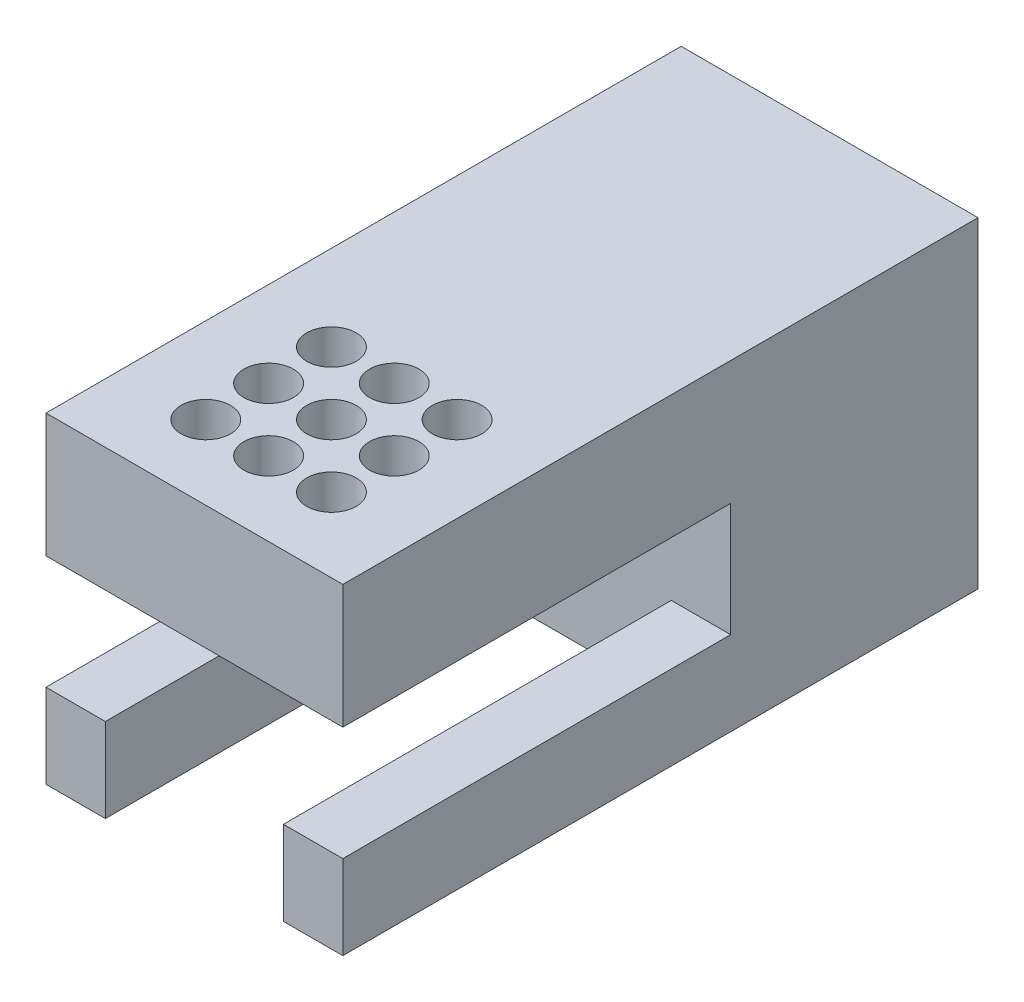
ISO-10303-21;
HEADER;
FILE_DESCRIPTION(('STEP AP214'),'2;1');
FILE_NAME('part.step','',(''),(''),'','','');
FILE_SCHEMA(('AUTOMOTIVE_DESIGN { 1 0 10303 214 1 1 1 1 }'));
ENDSEC;
DATA;
#1=APPLICATION_CONTEXT('core data for automotive mechanical design processes');
#2=APPLICATION_PROTOCOL_DEFINITION('international standard','automotive_design',2000,#1);
#3=PRODUCT_CONTEXT('',#1,'mechanical');
#4=PRODUCT('Part','Part','',(#3));
#5=PRODUCT_RELATED_PRODUCT_CATEGORY('part','',(#4));
#6=PRODUCT_DEFINITION_FORMATION('','',#4);
#7=PRODUCT_DEFINITION_CONTEXT('part definition',#1,'design');
#8=PRODUCT_DEFINITION('design','',#6,#7);
#9=PRODUCT_DEFINITION_SHAPE('','',#8);
#10=(LENGTH_UNIT() NAMED_UNIT(*) SI_UNIT(.MILLI.,.METRE.));
#11=(NAMED_UNIT(*) PLANE_ANGLE_UNIT() SI_UNIT($,.RADIAN.));
#12=(NAMED_UNIT(*) SI_UNIT($,.STERADIAN.) SOLID_ANGLE_UNIT());
#13=UNCERTAINTY_MEASURE_WITH_UNIT(LENGTH_MEASURE(1.E-05),#10,'distance_accuracy_value','');
#14=(GEOMETRIC_REPRESENTATION_CONTEXT(3) GLOBAL_UNCERTAINTY_ASSIGNED_CONTEXT((#13)) GLOBAL_UNIT_ASSIGNED_CONTEXT((#10,
#11,#12)) REPRESENTATION_CONTEXT('',''));
#15=CARTESIAN_POINT('',(0.,0.,0.));
#16=DIRECTION('',(0.,0.,1.));
#17=DIRECTION('',(1.,0.,0.));
#18=AXIS2_PLACEMENT_3D('',#15,#16,#17);
#19=CARTESIAN_POINT('',(0.,-8.,-10.14));
#20=DIRECTION('',(0.,0.,1.));
#21=DIRECTION('',(1.,0.,0.));
#22=AXIS2_PLACEMENT_3D('',#19,#20,#21);
#23=PLANE('',#22);
#24=DIRECTION('',(1.,0.,0.));
#25=VECTOR('',#24,1.);
#26=CARTESIAN_POINT('',(0.,-8.,-10.14));
#27=LINE('',#26,#25);
#28=CARTESIAN_POINT('',(-3.6,-8.,-10.14));
#29=VERTEX_POINT('',#28);
#30=CARTESIAN_POINT('',(3.6,-8.,-10.14));
#31=VERTEX_POINT('',#30);
#32=EDGE_CURVE('E204',#29,#31,#27,.T.);
#33=ORIENTED_EDGE('',*,*,#32,.T.);
#34=DIRECTION('',(0.,-1.,0.));
#35=VECTOR('',#34,1.);
#36=CARTESIAN_POINT('',(3.6,-8.,-10.14));
#37=LINE('',#36,#35);
#38=CARTESIAN_POINT('',(3.6,-4.6,-10.14));
#39=VERTEX_POINT('',#38);
#40=EDGE_CURVE('E63',#39,#31,#37,.T.);
#41=ORIENTED_EDGE('',*,*,#40,.F.);
#42=DIRECTION('',(-1.,0.,0.));
#43=VECTOR('',#42,1.);
#44=CARTESIAN_POINT('',(6.,-4.6,-10.14));
#45=LINE('',#44,#43);
#46=CARTESIAN_POINT('',(6.,-4.6,-10.14));
#47=VERTEX_POINT('',#46);
#48=EDGE_CURVE('E68',#47,#39,#45,.T.);
#49=ORIENTED_EDGE('',*,*,#48,.F.);
#50=DIRECTION('',(0.,1.,0.));
#51=VECTOR('',#50,1.);
#52=CARTESIAN_POINT('',(6.,-8.,-10.14));
#53=LINE('',#52,#51);
#54=CARTESIAN_POINT('',(6.,0.,-10.14));
#55=VERTEX_POINT('',#54);
#56=EDGE_CURVE('E219',#47,#55,#53,.T.);
#57=ORIENTED_EDGE('',*,*,#56,.T.);
#58=DIRECTION('',(1.,0.,0.));
#59=VECTOR('',#58,1.);
#60=CARTESIAN_POINT('',(0.,0.,-10.14));
#61=LINE('',#60,#59);
#62=CARTESIAN_POINT('',(-6.,0.,-10.14));
#63=VERTEX_POINT('',#62);
#64=EDGE_CURVE('E180',#63,#55,#61,.T.);
#65=ORIENTED_EDGE('',*,*,#64,.F.);
#66=DIRECTION('',(0.,1.,0.));
#67=VECTOR('',#66,1.);
#68=CARTESIAN_POINT('',(-6.,-8.,-10.14));
#69=LINE('',#68,#67);
#70=CARTESIAN_POINT('',(-6.,-4.6,-10.14));
#71=VERTEX_POINT('',#70);
#72=EDGE_CURVE('E223',#71,#63,#69,.T.);
#73=ORIENTED_EDGE('',*,*,#72,.F.);
#74=DIRECTION('',(-1.,0.,0.));
#75=VECTOR('',#74,1.);
#76=CARTESIAN_POINT('',(-6.,-4.6,-10.14));
#77=LINE('',#76,#75);
#78=CARTESIAN_POINT('',(-3.6,-4.6,-10.14));
#79=VERTEX_POINT('',#78);
#80=EDGE_CURVE('E185',#79,#71,#77,.T.);
#81=ORIENTED_EDGE('',*,*,#80,.F.);
#82=DIRECTION('',(0.,1.,0.));
#83=VECTOR('',#82,1.);
#84=CARTESIAN_POINT('',(-3.6,-8.,-10.14));
#85=LINE('',#84,#83);
#86=EDGE_CURVE('E181',#29,#79,#85,.T.);
#87=ORIENTED_EDGE('',*,*,#86,.F.);
#88=EDGE_LOOP('',(#33,#41,#49,#57,#65,#73,#81,#87));
#89=FACE_BOUND('',#88,.T.);
#90=ADVANCED_FACE('F47',(#89),#23,.T.);
#91=CARTESIAN_POINT('',(6.,5.,0.));
#92=DIRECTION('',(1.,0.,0.));
#93=DIRECTION('',(0.,0.,-1.));
#94=AXIS2_PLACEMENT_3D('',#91,#92,#93);
#95=PLANE('',#94);
#96=DIRECTION('',(0.,0.,1.));
#97=VECTOR('',#96,1.);
#98=CARTESIAN_POINT('',(6.,0.,0.));
#99=LINE('',#98,#97);
#100=CARTESIAN_POINT('',(6.,0.,5.54000000000001));
#101=VERTEX_POINT('',#100);
#102=EDGE_CURVE('E316',#55,#101,#99,.T.);
#103=ORIENTED_EDGE('',*,*,#102,.F.);
#104=ORIENTED_EDGE('',*,*,#56,.F.);
#105=DIRECTION('',(0.,0.,-1.));
#106=VECTOR('',#105,1.);
#107=CARTESIAN_POINT('',(6.,-4.6,9.70173040933697));
#108=LINE('',#107,#106);
#109=CARTESIAN_POINT('',(6.,-4.6,5.54000000000001));
#110=VERTEX_POINT('',#109);
#111=EDGE_CURVE('E153',#110,#47,#108,.T.);
#112=ORIENTED_EDGE('',*,*,#111,.F.);
#113=DIRECTION('',(0.,-1.,0.));
#114=VECTOR('',#113,1.);
#115=CARTESIAN_POINT('',(6.,-8.,5.54000000000001));
#116=LINE('',#115,#114);
#117=CARTESIAN_POINT('',(6.,-8.,5.54000000000001));
#118=VERTEX_POINT('',#117);
#119=EDGE_CURVE('E142',#110,#118,#116,.T.);
#120=ORIENTED_EDGE('',*,*,#119,.T.);
#121=DIRECTION('',(0.,0.,-1.));
#122=VECTOR('',#121,1.);
#123=CARTESIAN_POINT('',(6.,-8.,0.));
#124=LINE('',#123,#122);
#125=CARTESIAN_POINT('',(6.,-8.,-20.14));
#126=VERTEX_POINT('',#125);
#127=EDGE_CURVE('E207',#118,#126,#124,.T.);
#128=ORIENTED_EDGE('',*,*,#127,.T.);
#129=DIRECTION('',(0.,-1.,0.));
#130=VECTOR('',#129,1.);
#131=CARTESIAN_POINT('',(6.,5.,-20.14));
#132=LINE('',#131,#130);
#133=CARTESIAN_POINT('',(6.,5.,-20.14));
#134=VERTEX_POINT('',#133);
#135=EDGE_CURVE('E11',#134,#126,#132,.T.);
#136=ORIENTED_EDGE('',*,*,#135,.F.);
#137=DIRECTION('',(0.,0.,1.));
#138=VECTOR('',#137,1.);
#139=CARTESIAN_POINT('',(6.,5.,0.));
#140=LINE('',#139,#138);
#141=CARTESIAN_POINT('',(6.,5.,5.54000000000001));
#142=VERTEX_POINT('',#141);
#143=EDGE_CURVE('E266',#134,#142,#140,.T.);
#144=ORIENTED_EDGE('',*,*,#143,.T.);
#145=DIRECTION('',(0.,-1.,0.));
#146=VECTOR('',#145,1.);
#147=CARTESIAN_POINT('',(6.,5.,5.54000000000001));
#148=LINE('',#147,#146);
#149=EDGE_CURVE('E280',#142,#101,#148,.T.);
#150=ORIENTED_EDGE('',*,*,#149,.T.);
#151=EDGE_LOOP('',(#103,#104,#112,#120,#128,#136,#144,#150));
#152=FACE_BOUND('',#151,.T.);
#153=ADVANCED_FACE('F347',(#152),#95,.T.);
#154=CARTESIAN_POINT('',(0.,5.,-20.14));
#155=DIRECTION('',(0.,0.,-1.));
#156=DIRECTION('',(-1.,0.,0.));
#157=AXIS2_PLACEMENT_3D('',#154,#155,#156);
#158=PLANE('',#157);
#159=ORIENTED_EDGE('',*,*,#135,.T.);
#160=DIRECTION('',(1.,0.,0.));
#161=VECTOR('',#160,1.);
#162=CARTESIAN_POINT('',(0.,-8.,-20.14));
#163=LINE('',#162,#161);
#164=CARTESIAN_POINT('',(-6.,-8.,-20.14));
#165=VERTEX_POINT('',#164);
#166=EDGE_CURVE('E211',#165,#126,#163,.T.);
#167=ORIENTED_EDGE('',*,*,#166,.F.);
#168=DIRECTION('',(0.,-1.,0.));
#169=VECTOR('',#168,1.);
#170=CARTESIAN_POINT('',(-6.,5.,-20.14));
#171=LINE('',#170,#169);
#172=CARTESIAN_POINT('',(-6.,5.,-20.14));
#173=VERTEX_POINT('',#172);
#174=EDGE_CURVE('E56',#173,#165,#171,.T.);
#175=ORIENTED_EDGE('',*,*,#174,.F.);
#176=DIRECTION('',(1.,0.,0.));
#177=VECTOR('',#176,1.);
#178=CARTESIAN_POINT('',(0.,5.,-20.14));
#179=LINE('',#178,#177);
#180=EDGE_CURVE('E270',#173,#134,#179,.T.);
#181=ORIENTED_EDGE('',*,*,#180,.T.);
#182=EDGE_LOOP('',(#159,#167,#175,#181));
#183=FACE_BOUND('',#182,.T.);
#184=ADVANCED_FACE('F343',(#183),#158,.T.);
#185=CARTESIAN_POINT('',(-6.,5.,0.));
#186=DIRECTION('',(1.,0.,0.));
#187=DIRECTION('',(0.,0.,-1.));
#188=AXIS2_PLACEMENT_3D('',#185,#186,#187);
#189=PLANE('',#188);
#190=ORIENTED_EDGE('',*,*,#174,.T.);
#191=DIRECTION('',(0.,0.,-1.));
#192=VECTOR('',#191,1.);
#193=CARTESIAN_POINT('',(-6.,-8.,0.));
#194=LINE('',#193,#192);
#195=CARTESIAN_POINT('',(-6.,-8.,5.54000000000001));
#196=VERTEX_POINT('',#195);
#197=EDGE_CURVE('E215',#196,#165,#194,.T.);
#198=ORIENTED_EDGE('',*,*,#197,.F.);
#199=DIRECTION('',(0.,1.,0.));
#200=VECTOR('',#199,1.);
#201=CARTESIAN_POINT('',(-6.,-8.,5.54000000000001));
#202=LINE('',#201,#200);
#203=CARTESIAN_POINT('',(-6.,-4.6,5.54000000000001));
#204=VERTEX_POINT('',#203);
#205=EDGE_CURVE('E176',#196,#204,#202,.T.);
#206=ORIENTED_EDGE('',*,*,#205,.T.);
#207=DIRECTION('',(0.,0.,-1.));
#208=VECTOR('',#207,1.);
#209=CARTESIAN_POINT('',(-6.,-4.6,9.70173040933697));
#210=LINE('',#209,#208);
#211=EDGE_CURVE('E189',#204,#71,#210,.T.);
#212=ORIENTED_EDGE('',*,*,#211,.T.);
#213=ORIENTED_EDGE('',*,*,#72,.T.);
#214=DIRECTION('',(0.,0.,1.));
#215=VECTOR('',#214,1.);
#216=CARTESIAN_POINT('',(-6.,0.,0.));
#217=LINE('',#216,#215);
#218=CARTESIAN_POINT('',(-6.,0.,5.54000000000001));
#219=VERTEX_POINT('',#218);
#220=EDGE_CURVE('E319',#63,#219,#217,.T.);
#221=ORIENTED_EDGE('',*,*,#220,.T.);
#222=DIRECTION('',(0.,-1.,0.));
#223=VECTOR('',#222,1.);
#224=CARTESIAN_POINT('',(-6.,5.,5.54000000000001));
#225=LINE('',#224,#223);
#226=CARTESIAN_POINT('',(-6.,5.,5.54000000000001));
#227=VERTEX_POINT('',#226);
#228=EDGE_CURVE('E328',#227,#219,#225,.T.);
#229=ORIENTED_EDGE('',*,*,#228,.F.);
#230=DIRECTION('',(0.,0.,1.));
#231=VECTOR('',#230,1.);
#232=CARTESIAN_POINT('',(-6.,5.,0.));
#233=LINE('',#232,#231);
#234=EDGE_CURVE('E274',#173,#227,#233,.T.);
#235=ORIENTED_EDGE('',*,*,#234,.F.);
#236=EDGE_LOOP('',(#190,#198,#206,#212,#213,#221,#229,#235));
#237=FACE_BOUND('',#236,.T.);
#238=ADVANCED_FACE('F334',(#237),#189,.F.);
#239=CARTESIAN_POINT('',(-2.54,5.,0.));
#240=DIRECTION('',(0.,-1.,0.));
#241=DIRECTION('',(0.,0.,-1.));
#242=AXIS2_PLACEMENT_3D('',#239,#240,#241);
#243=CYLINDRICAL_SURFACE('',#242,1.);
#244=CARTESIAN_POINT('',(-2.54,5.,0.));
#245=DIRECTION('',(0.,1.,0.));
#246=DIRECTION('',(0.,0.,1.));
#247=AXIS2_PLACEMENT_3D('',#244,#245,#246);
#248=CIRCLE('',#247,1.);
#249=CARTESIAN_POINT('',(-2.54,5.,1.));
#250=VERTEX_POINT('',#249);
#251=EDGE_CURVE('E262',#250,#250,#248,.T.);
#252=ORIENTED_EDGE('',*,*,#251,.T.);
#253=EDGE_LOOP('',(#252));
#254=FACE_BOUND('',#253,.T.);
#255=CARTESIAN_POINT('',(-2.54,0.,0.));
#256=DIRECTION('',(0.,1.,0.));
#257=DIRECTION('',(0.,0.,1.));
#258=AXIS2_PLACEMENT_3D('',#255,#256,#257);
#259=CIRCLE('',#258,1.);
#260=CARTESIAN_POINT('',(-2.54,0.,1.));
#261=VERTEX_POINT('',#260);
#262=EDGE_CURVE('E312',#261,#261,#259,.T.);
#263=ORIENTED_EDGE('',*,*,#262,.F.);
#264=EDGE_LOOP('',(#263));
#265=FACE_BOUND('',#264,.T.);
#266=ADVANCED_FACE('F401',(#254,#265),#243,.F.);
#267=CARTESIAN_POINT('',(0.,5.,0.));
#268=DIRECTION('',(0.,-1.,0.));
#269=DIRECTION('',(0.,0.,-1.));
#270=AXIS2_PLACEMENT_3D('',#267,#268,#269);
#271=CYLINDRICAL_SURFACE('',#270,1.);
#272=CARTESIAN_POINT('',(0.,5.,0.));
#273=DIRECTION('',(0.,1.,0.));
#274=DIRECTION('',(0.,0.,1.));
#275=AXIS2_PLACEMENT_3D('',#272,#273,#274);
#276=CIRCLE('',#275,1.);
#277=CARTESIAN_POINT('',(0.,5.,1.));
#278=VERTEX_POINT('',#277);
#279=EDGE_CURVE('E258',#278,#278,#276,.T.);
#280=ORIENTED_EDGE('',*,*,#279,.T.);
#281=EDGE_LOOP('',(#280));
#282=FACE_BOUND('',#281,.T.);
#283=CARTESIAN_POINT('',(0.,0.,0.));
#284=DIRECTION('',(0.,1.,0.));
#285=DIRECTION('',(0.,0.,1.));
#286=AXIS2_PLACEMENT_3D('',#283,#284,#285);
#287=CIRCLE('',#286,1.);
#288=CARTESIAN_POINT('',(0.,0.,1.));
#289=VERTEX_POINT('',#288);
#290=EDGE_CURVE('E308',#289,#289,#287,.T.);
#291=ORIENTED_EDGE('',*,*,#290,.F.);
#292=EDGE_LOOP('',(#291));
#293=FACE_BOUND('',#292,.T.);
#294=ADVANCED_FACE('F406',(#282,#293),#271,.F.);
#295=CARTESIAN_POINT('',(2.54000000000001,5.,0.));
#296=DIRECTION('',(0.,-1.,0.));
#297=DIRECTION('',(0.,0.,-1.));
#298=AXIS2_PLACEMENT_3D('',#295,#296,#297);
#299=CYLINDRICAL_SURFACE('',#298,1.);
#300=CARTESIAN_POINT('',(2.54000000000001,5.,0.));
#301=DIRECTION('',(0.,1.,0.));
#302=DIRECTION('',(0.,0.,1.));
#303=AXIS2_PLACEMENT_3D('',#300,#301,#302);
#304=CIRCLE('',#303,1.);
#305=CARTESIAN_POINT('',(2.54000000000001,5.,0.999999999999999));
#306=VERTEX_POINT('',#305);
#307=EDGE_CURVE('E254',#306,#306,#304,.T.);
#308=ORIENTED_EDGE('',*,*,#307,.T.);
#309=EDGE_LOOP('',(#308));
#310=FACE_BOUND('',#309,.T.);
#311=CARTESIAN_POINT('',(2.54000000000001,0.,0.));
#312=DIRECTION('',(0.,1.,0.));
#313=DIRECTION('',(0.,0.,1.));
#314=AXIS2_PLACEMENT_3D('',#311,#312,#313);
#315=CIRCLE('',#314,1.);
#316=CARTESIAN_POINT('',(2.54000000000001,0.,0.999999999999999));
#317=VERTEX_POINT('',#316);
#318=EDGE_CURVE('E304',#317,#317,#315,.T.);
#319=ORIENTED_EDGE('',*,*,#318,.F.);
#320=EDGE_LOOP('',(#319));
#321=FACE_BOUND('',#320,.T.);
#322=ADVANCED_FACE('F410',(#310,#321),#299,.F.);
#323=CARTESIAN_POINT('',(2.54000000000001,5.,2.54000000000001));
#324=DIRECTION('',(0.,-1.,0.));
#325=DIRECTION('',(0.,0.,-1.));
#326=AXIS2_PLACEMENT_3D('',#323,#324,#325);
#327=CYLINDRICAL_SURFACE('',#326,1.);
#328=CARTESIAN_POINT('',(2.54000000000001,5.,2.54000000000001));
#329=DIRECTION('',(0.,1.,0.));
#330=DIRECTION('',(0.,0.,1.));
#331=AXIS2_PLACEMENT_3D('',#328,#329,#330);
#332=CIRCLE('',#331,1.);
#333=CARTESIAN_POINT('',(2.54000000000001,5.,3.54000000000001));
#334=VERTEX_POINT('',#333);
#335=EDGE_CURVE('E250',#334,#334,#332,.T.);
#336=ORIENTED_EDGE('',*,*,#335,.T.);
#337=EDGE_LOOP('',(#336));
#338=FACE_BOUND('',#337,.T.);
#339=CARTESIAN_POINT('',(2.54000000000001,0.,2.54000000000001));
#340=DIRECTION('',(0.,1.,0.));
#341=DIRECTION('',(0.,0.,1.));
#342=AXIS2_PLACEMENT_3D('',#339,#340,#341);
#343=CIRCLE('',#342,1.);
#344=CARTESIAN_POINT('',(2.54000000000001,0.,3.54000000000001));
#345=VERTEX_POINT('',#344);
#346=EDGE_CURVE('E300',#345,#345,#343,.T.);
#347=ORIENTED_EDGE('',*,*,#346,.F.);
#348=EDGE_LOOP('',(#347));
#349=FACE_BOUND('',#348,.T.);
#350=ADVANCED_FACE('F414',(#338,#349),#327,.F.);
#351=CARTESIAN_POINT('',(0.,5.,2.54000000000001));
#352=DIRECTION('',(0.,-1.,0.));
#353=DIRECTION('',(0.,0.,-1.));
#354=AXIS2_PLACEMENT_3D('',#351,#352,#353);
#355=CYLINDRICAL_SURFACE('',#354,1.);
#356=CARTESIAN_POINT('',(0.,5.,2.54000000000001));
#357=DIRECTION('',(0.,1.,0.));
#358=DIRECTION('',(0.,0.,1.));
#359=AXIS2_PLACEMENT_3D('',#356,#357,#358);
#360=CIRCLE('',#359,1.);
#361=CARTESIAN_POINT('',(0.,5.,3.54000000000001));
#362=VERTEX_POINT('',#361);
#363=EDGE_CURVE('E246',#362,#362,#360,.T.);
#364=ORIENTED_EDGE('',*,*,#363,.T.);
#365=EDGE_LOOP('',(#364));
#366=FACE_BOUND('',#365,.T.);
#367=CARTESIAN_POINT('',(0.,0.,2.54000000000001));
#368=DIRECTION('',(0.,1.,0.));
#369=DIRECTION('',(0.,0.,1.));
#370=AXIS2_PLACEMENT_3D('',#367,#368,#369);
#371=CIRCLE('',#370,1.);
#372=CARTESIAN_POINT('',(0.,0.,3.54000000000001));
#373=VERTEX_POINT('',#372);
#374=EDGE_CURVE('E296',#373,#373,#371,.T.);
#375=ORIENTED_EDGE('',*,*,#374,.F.);
#376=EDGE_LOOP('',(#375));
#377=FACE_BOUND('',#376,.T.);
#378=ADVANCED_FACE('F418',(#366,#377),#355,.F.);
#379=CARTESIAN_POINT('',(-2.54,5.,2.54000000000001));
#380=DIRECTION('',(0.,-1.,0.));
#381=DIRECTION('',(0.,0.,-1.));
#382=AXIS2_PLACEMENT_3D('',#379,#380,#381);
#383=CYLINDRICAL_SURFACE('',#382,1.);
#384=CARTESIAN_POINT('',(-2.54,5.,2.54000000000001));
#385=DIRECTION('',(0.,1.,0.));
#386=DIRECTION('',(0.,0.,1.));
#387=AXIS2_PLACEMENT_3D('',#384,#385,#386);
#388=CIRCLE('',#387,1.);
#389=CARTESIAN_POINT('',(-2.54,5.,3.54000000000001));
#390=VERTEX_POINT('',#389);
#391=EDGE_CURVE('E242',#390,#390,#388,.T.);
#392=ORIENTED_EDGE('',*,*,#391,.T.);
#393=EDGE_LOOP('',(#392));
#394=FACE_BOUND('',#393,.T.);
#395=CARTESIAN_POINT('',(-2.54,0.,2.54000000000001));
#396=DIRECTION('',(0.,1.,0.));
#397=DIRECTION('',(0.,0.,1.));
#398=AXIS2_PLACEMENT_3D('',#395,#396,#397);
#399=CIRCLE('',#398,1.);
#400=CARTESIAN_POINT('',(-2.54,0.,3.54000000000001));
#401=VERTEX_POINT('',#400);
#402=EDGE_CURVE('E292',#401,#401,#399,.T.);
#403=ORIENTED_EDGE('',*,*,#402,.F.);
#404=EDGE_LOOP('',(#403));
#405=FACE_BOUND('',#404,.T.);
#406=ADVANCED_FACE('F422',(#394,#405),#383,.F.);
#407=CARTESIAN_POINT('',(-2.54,5.,-2.54));
#408=DIRECTION('',(0.,-1.,0.));
#409=DIRECTION('',(0.,0.,-1.));
#410=AXIS2_PLACEMENT_3D('',#407,#408,#409);
#411=CYLINDRICAL_SURFACE('',#410,1.);
#412=CARTESIAN_POINT('',(-2.54,5.,-2.54));
#413=DIRECTION('',(0.,1.,0.));
#414=DIRECTION('',(0.,0.,1.));
#415=AXIS2_PLACEMENT_3D('',#412,#413,#414);
#416=CIRCLE('',#415,1.);
#417=CARTESIAN_POINT('',(-2.54,5.,-1.54));
#418=VERTEX_POINT('',#417);
#419=EDGE_CURVE('E238',#418,#418,#416,.T.);
#420=ORIENTED_EDGE('',*,*,#419,.T.);
#421=EDGE_LOOP('',(#420));
#422=FACE_BOUND('',#421,.T.);
#423=CARTESIAN_POINT('',(-2.54,0.,-2.54));
#424=DIRECTION('',(0.,1.,0.));
#425=DIRECTION('',(0.,0.,1.));
#426=AXIS2_PLACEMENT_3D('',#423,#424,#425);
#427=CIRCLE('',#426,1.);
#428=CARTESIAN_POINT('',(-2.54,0.,-1.54));
#429=VERTEX_POINT('',#428);
#430=EDGE_CURVE('E288',#429,#429,#427,.T.);
#431=ORIENTED_EDGE('',*,*,#430,.F.);
#432=EDGE_LOOP('',(#431));
#433=FACE_BOUND('',#432,.T.);
#434=ADVANCED_FACE('F426',(#422,#433),#411,.F.);
#435=CARTESIAN_POINT('',(0.,5.,-2.54));
#436=DIRECTION('',(0.,-1.,0.));
#437=DIRECTION('',(0.,0.,-1.));
#438=AXIS2_PLACEMENT_3D('',#435,#436,#437);
#439=CYLINDRICAL_SURFACE('',#438,1.);
#440=CARTESIAN_POINT('',(0.,5.,-2.54));
#441=DIRECTION('',(0.,1.,0.));
#442=DIRECTION('',(0.,0.,1.));
#443=AXIS2_PLACEMENT_3D('',#440,#441,#442);
#444=CIRCLE('',#443,1.);
#445=CARTESIAN_POINT('',(0.,5.,-1.54));
#446=VERTEX_POINT('',#445);
#447=EDGE_CURVE('E233',#446,#446,#444,.T.);
#448=ORIENTED_EDGE('',*,*,#447,.T.);
#449=EDGE_LOOP('',(#448));
#450=FACE_BOUND('',#449,.T.);
#451=CARTESIAN_POINT('',(0.,0.,-2.54));
#452=DIRECTION('',(0.,1.,0.));
#453=DIRECTION('',(0.,0.,1.));
#454=AXIS2_PLACEMENT_3D('',#451,#452,#453);
#455=CIRCLE('',#454,1.);
#456=CARTESIAN_POINT('',(0.,0.,-1.54));
#457=VERTEX_POINT('',#456);
#458=EDGE_CURVE('E284',#457,#457,#455,.T.);
#459=ORIENTED_EDGE('',*,*,#458,.F.);
#460=EDGE_LOOP('',(#459));
#461=FACE_BOUND('',#460,.T.);
#462=ADVANCED_FACE('F429',(#450,#461),#439,.F.);
#463=CARTESIAN_POINT('',(2.54000000000001,5.,-2.54));
#464=DIRECTION('',(0.,-1.,0.));
#465=DIRECTION('',(0.,0.,-1.));
#466=AXIS2_PLACEMENT_3D('',#463,#464,#465);
#467=CYLINDRICAL_SURFACE('',#466,1.);
#468=CARTESIAN_POINT('',(2.54000000000001,5.,-2.54));
#469=DIRECTION('',(0.,1.,0.));
#470=DIRECTION('',(0.,0.,1.));
#471=AXIS2_PLACEMENT_3D('',#468,#469,#470);
#472=CIRCLE('',#471,1.);
#473=CARTESIAN_POINT('',(2.54000000000001,5.,-1.54));
#474=VERTEX_POINT('',#473);
#475=EDGE_CURVE('E229',#474,#474,#472,.T.);
#476=ORIENTED_EDGE('',*,*,#475,.T.);
#477=EDGE_LOOP('',(#476));
#478=FACE_BOUND('',#477,.T.);
#479=CARTESIAN_POINT('',(2.54000000000001,0.,-2.54));
#480=DIRECTION('',(0.,1.,0.));
#481=DIRECTION('',(0.,0.,1.));
#482=AXIS2_PLACEMENT_3D('',#479,#480,#481);
#483=CIRCLE('',#482,1.);
#484=CARTESIAN_POINT('',(2.54000000000001,0.,-1.54));
#485=VERTEX_POINT('',#484);
#486=EDGE_CURVE('E226',#485,#485,#483,.T.);
#487=ORIENTED_EDGE('',*,*,#486,.F.);
#488=EDGE_LOOP('',(#487));
#489=FACE_BOUND('',#488,.T.);
#490=ADVANCED_FACE('F49',(#478,#489),#467,.F.);
#491=CARTESIAN_POINT('',(0.,5.,5.54000000000001));
#492=DIRECTION('',(0.,0.,-1.));
#493=DIRECTION('',(-1.,0.,0.));
#494=AXIS2_PLACEMENT_3D('',#491,#492,#493);
#495=PLANE('',#494);
#496=DIRECTION('',(1.,0.,0.));
#497=VECTOR('',#496,1.);
#498=CARTESIAN_POINT('',(0.,0.,5.54000000000001));
#499=LINE('',#498,#497);
#500=EDGE_CURVE('E234',#219,#101,#499,.T.);
#501=ORIENTED_EDGE('',*,*,#500,.T.);
#502=ORIENTED_EDGE('',*,*,#149,.F.);
#503=DIRECTION('',(1.,0.,0.));
#504=VECTOR('',#503,1.);
#505=CARTESIAN_POINT('',(0.,5.,5.54000000000001));
#506=LINE('',#505,#504);
#507=EDGE_CURVE('E277',#227,#142,#506,.T.);
#508=ORIENTED_EDGE('',*,*,#507,.F.);
#509=ORIENTED_EDGE('',*,*,#228,.T.);
#510=EDGE_LOOP('',(#501,#502,#508,#509));
#511=FACE_BOUND('',#510,.T.);
#512=ADVANCED_FACE('F352',(#511),#495,.F.);
#513=CARTESIAN_POINT('',(0.,5.,0.));
#514=DIRECTION('',(0.,1.,0.));
#515=DIRECTION('',(0.,0.,1.));
#516=AXIS2_PLACEMENT_3D('',#513,#514,#515);
#517=PLANE('',#516);
#518=ORIENTED_EDGE('',*,*,#475,.F.);
#519=EDGE_LOOP('',(#518));
#520=FACE_BOUND('',#519,.T.);
#521=ORIENTED_EDGE('',*,*,#447,.F.);
#522=EDGE_LOOP('',(#521));
#523=FACE_BOUND('',#522,.T.);
#524=ORIENTED_EDGE('',*,*,#419,.F.);
#525=EDGE_LOOP('',(#524));
#526=FACE_BOUND('',#525,.T.);
#527=ORIENTED_EDGE('',*,*,#391,.F.);
#528=EDGE_LOOP('',(#527));
#529=FACE_BOUND('',#528,.T.);
#530=ORIENTED_EDGE('',*,*,#363,.F.);
#531=EDGE_LOOP('',(#530));
#532=FACE_BOUND('',#531,.T.);
#533=ORIENTED_EDGE('',*,*,#335,.F.);
#534=EDGE_LOOP('',(#533));
#535=FACE_BOUND('',#534,.T.);
#536=ORIENTED_EDGE('',*,*,#307,.F.);
#537=EDGE_LOOP('',(#536));
#538=FACE_BOUND('',#537,.T.);
#539=ORIENTED_EDGE('',*,*,#279,.F.);
#540=EDGE_LOOP('',(#539));
#541=FACE_BOUND('',#540,.T.);
#542=ORIENTED_EDGE('',*,*,#251,.F.);
#543=EDGE_LOOP('',(#542));
#544=FACE_BOUND('',#543,.T.);
#545=ORIENTED_EDGE('',*,*,#143,.F.);
#546=ORIENTED_EDGE('',*,*,#180,.F.);
#547=ORIENTED_EDGE('',*,*,#234,.T.);
#548=ORIENTED_EDGE('',*,*,#507,.T.);
#549=EDGE_LOOP('',(#545,#546,#547,#548));
#550=FACE_BOUND('',#549,.T.);
#551=ADVANCED_FACE('F349',(#520,#523,#526,#529,#532,#535,#538,#541,#544,#550),#517,.T.);
#552=CARTESIAN_POINT('',(0.,0.,0.));
#553=DIRECTION('',(0.,1.,0.));
#554=DIRECTION('',(0.,0.,1.));
#555=AXIS2_PLACEMENT_3D('',#552,#553,#554);
#556=PLANE('',#555);
#557=ORIENTED_EDGE('',*,*,#486,.T.);
#558=EDGE_LOOP('',(#557));
#559=FACE_BOUND('',#558,.T.);
#560=ORIENTED_EDGE('',*,*,#458,.T.);
#561=EDGE_LOOP('',(#560));
#562=FACE_BOUND('',#561,.T.);
#563=ORIENTED_EDGE('',*,*,#430,.T.);
#564=EDGE_LOOP('',(#563));
#565=FACE_BOUND('',#564,.T.);
#566=ORIENTED_EDGE('',*,*,#402,.T.);
#567=EDGE_LOOP('',(#566));
#568=FACE_BOUND('',#567,.T.);
#569=ORIENTED_EDGE('',*,*,#374,.T.);
#570=EDGE_LOOP('',(#569));
#571=FACE_BOUND('',#570,.T.);
#572=ORIENTED_EDGE('',*,*,#346,.T.);
#573=EDGE_LOOP('',(#572));
#574=FACE_BOUND('',#573,.T.);
#575=ORIENTED_EDGE('',*,*,#318,.T.);
#576=EDGE_LOOP('',(#575));
#577=FACE_BOUND('',#576,.T.);
#578=ORIENTED_EDGE('',*,*,#290,.T.);
#579=EDGE_LOOP('',(#578));
#580=FACE_BOUND('',#579,.T.);
#581=ORIENTED_EDGE('',*,*,#262,.T.);
#582=EDGE_LOOP('',(#581));
#583=FACE_BOUND('',#582,.T.);
#584=ORIENTED_EDGE('',*,*,#220,.F.);
#585=ORIENTED_EDGE('',*,*,#64,.T.);
#586=ORIENTED_EDGE('',*,*,#102,.T.);
#587=ORIENTED_EDGE('',*,*,#500,.F.);
#588=EDGE_LOOP('',(#584,#585,#586,#587));
#589=FACE_BOUND('',#588,.T.);
#590=ADVANCED_FACE('F356',(#559,#562,#565,#568,#571,#574,#577,#580,#583,#589),#556,.F.);
#591=CARTESIAN_POINT('',(0.,-8.,0.));
#592=DIRECTION('',(0.,1.,0.));
#593=DIRECTION('',(0.,0.,1.));
#594=AXIS2_PLACEMENT_3D('',#591,#592,#593);
#595=PLANE('',#594);
#596=ORIENTED_EDGE('',*,*,#32,.F.);
#597=DIRECTION('',(0.,0.,-1.));
#598=VECTOR('',#597,1.);
#599=CARTESIAN_POINT('',(-3.6,-8.,9.70173040933697));
#600=LINE('',#599,#598);
#601=CARTESIAN_POINT('',(-3.6,-8.,5.54000000000001));
#602=VERTEX_POINT('',#601);
#603=EDGE_CURVE('E197',#602,#29,#600,.T.);
#604=ORIENTED_EDGE('',*,*,#603,.F.);
#605=DIRECTION('',(-1.,0.,0.));
#606=VECTOR('',#605,1.);
#607=CARTESIAN_POINT('',(-6.,-8.,5.54000000000001));
#608=LINE('',#607,#606);
#609=EDGE_CURVE('E171',#602,#196,#608,.T.);
#610=ORIENTED_EDGE('',*,*,#609,.T.);
#611=ORIENTED_EDGE('',*,*,#197,.T.);
#612=ORIENTED_EDGE('',*,*,#166,.T.);
#613=ORIENTED_EDGE('',*,*,#127,.F.);
#614=DIRECTION('',(-1.,0.,0.));
#615=VECTOR('',#614,1.);
#616=CARTESIAN_POINT('',(6.,-8.,5.54000000000001));
#617=LINE('',#616,#615);
#618=CARTESIAN_POINT('',(3.6,-8.,5.54000000000001));
#619=VERTEX_POINT('',#618);
#620=EDGE_CURVE('E159',#118,#619,#617,.T.);
#621=ORIENTED_EDGE('',*,*,#620,.T.);
#622=DIRECTION('',(0.,0.,-1.));
#623=VECTOR('',#622,1.);
#624=CARTESIAN_POINT('',(3.6,-8.,9.70173040933697));
#625=LINE('',#624,#623);
#626=EDGE_CURVE('E152',#619,#31,#625,.T.);
#627=ORIENTED_EDGE('',*,*,#626,.T.);
#628=EDGE_LOOP('',(#596,#604,#610,#611,#612,#613,#621,#627));
#629=FACE_BOUND('',#628,.T.);
#630=ADVANCED_FACE('F341',(#629),#595,.F.);
#631=CARTESIAN_POINT('',(-6.,-4.6,9.70173040933697));
#632=DIRECTION('',(0.,-1.,0.));
#633=DIRECTION('',(0.,0.,-1.));
#634=AXIS2_PLACEMENT_3D('',#631,#632,#633);
#635=PLANE('',#634);
#636=ORIENTED_EDGE('',*,*,#211,.F.);
#637=DIRECTION('',(1.,0.,0.));
#638=VECTOR('',#637,1.);
#639=CARTESIAN_POINT('',(-6.,-4.6,5.54000000000001));
#640=LINE('',#639,#638);
#641=CARTESIAN_POINT('',(-3.6,-4.6,5.54000000000001));
#642=VERTEX_POINT('',#641);
#643=EDGE_CURVE('E172',#204,#642,#640,.T.);
#644=ORIENTED_EDGE('',*,*,#643,.T.);
#645=DIRECTION('',(0.,0.,-1.));
#646=VECTOR('',#645,1.);
#647=CARTESIAN_POINT('',(-3.6,-4.6,9.70173040933697));
#648=LINE('',#647,#646);
#649=EDGE_CURVE('E193',#642,#79,#648,.T.);
#650=ORIENTED_EDGE('',*,*,#649,.T.);
#651=ORIENTED_EDGE('',*,*,#80,.T.);
#652=EDGE_LOOP('',(#636,#644,#650,#651));
#653=FACE_BOUND('',#652,.T.);
#654=ADVANCED_FACE('F361',(#653),#635,.F.);
#655=CARTESIAN_POINT('',(-3.6,-8.,9.70173040933697));
#656=DIRECTION('',(-1.,0.,0.));
#657=DIRECTION('',(0.,0.,1.));
#658=AXIS2_PLACEMENT_3D('',#655,#656,#657);
#659=PLANE('',#658);
#660=ORIENTED_EDGE('',*,*,#649,.F.);
#661=DIRECTION('',(0.,-1.,0.));
#662=VECTOR('',#661,1.);
#663=CARTESIAN_POINT('',(-3.6,-8.,5.54000000000001));
#664=LINE('',#663,#662);
#665=EDGE_CURVE('E167',#642,#602,#664,.T.);
#666=ORIENTED_EDGE('',*,*,#665,.T.);
#667=ORIENTED_EDGE('',*,*,#603,.T.);
#668=ORIENTED_EDGE('',*,*,#86,.T.);
#669=EDGE_LOOP('',(#660,#666,#667,#668));
#670=FACE_BOUND('',#669,.T.);
#671=ADVANCED_FACE('F364',(#670),#659,.F.);
#672=CARTESIAN_POINT('',(0.,5.,5.54000000000001));
#673=DIRECTION('',(0.,0.,-1.));
#674=DIRECTION('',(-1.,0.,0.));
#675=AXIS2_PLACEMENT_3D('',#672,#673,#674);
#676=PLANE('',#675);
#677=ORIENTED_EDGE('',*,*,#609,.F.);
#678=ORIENTED_EDGE('',*,*,#665,.F.);
#679=ORIENTED_EDGE('',*,*,#643,.F.);
#680=ORIENTED_EDGE('',*,*,#205,.F.);
#681=EDGE_LOOP('',(#677,#678,#679,#680));
#682=FACE_BOUND('',#681,.T.);
#683=ADVANCED_FACE('F374',(#682),#676,.F.);
#684=CARTESIAN_POINT('',(3.6,-8.,9.70173040933697));
#685=DIRECTION('',(1.,0.,0.));
#686=DIRECTION('',(0.,0.,-1.));
#687=AXIS2_PLACEMENT_3D('',#684,#685,#686);
#688=PLANE('',#687);
#689=ORIENTED_EDGE('',*,*,#626,.F.);
#690=DIRECTION('',(0.,1.,0.));
#691=VECTOR('',#690,1.);
#692=CARTESIAN_POINT('',(3.6,-8.,5.54000000000001));
#693=LINE('',#692,#691);
#694=CARTESIAN_POINT('',(3.6,-4.6,5.54000000000001));
#695=VERTEX_POINT('',#694);
#696=EDGE_CURVE('E139',#619,#695,#693,.T.);
#697=ORIENTED_EDGE('',*,*,#696,.T.);
#698=DIRECTION('',(0.,0.,-1.));
#699=VECTOR('',#698,1.);
#700=CARTESIAN_POINT('',(3.6,-4.6,9.70173040933697));
#701=LINE('',#700,#699);
#702=EDGE_CURVE('E148',#695,#39,#701,.T.);
#703=ORIENTED_EDGE('',*,*,#702,.T.);
#704=ORIENTED_EDGE('',*,*,#40,.T.);
#705=EDGE_LOOP('',(#689,#697,#703,#704));
#706=FACE_BOUND('',#705,.T.);
#707=ADVANCED_FACE('F155',(#706),#688,.F.);
#708=CARTESIAN_POINT('',(6.,-4.6,9.70173040933697));
#709=DIRECTION('',(0.,-1.,0.));
#710=DIRECTION('',(0.,0.,-1.));
#711=AXIS2_PLACEMENT_3D('',#708,#709,#710);
#712=PLANE('',#711);
#713=ORIENTED_EDGE('',*,*,#702,.F.);
#714=DIRECTION('',(1.,0.,0.));
#715=VECTOR('',#714,1.);
#716=CARTESIAN_POINT('',(6.,-4.6,5.54000000000001));
#717=LINE('',#716,#715);
#718=EDGE_CURVE('E134',#695,#110,#717,.T.);
#719=ORIENTED_EDGE('',*,*,#718,.T.);
#720=ORIENTED_EDGE('',*,*,#111,.T.);
#721=ORIENTED_EDGE('',*,*,#48,.T.);
#722=EDGE_LOOP('',(#713,#719,#720,#721));
#723=FACE_BOUND('',#722,.T.);
#724=ADVANCED_FACE('F149',(#723),#712,.F.);
#725=CARTESIAN_POINT('',(0.,5.,5.54000000000001));
#726=DIRECTION('',(0.,0.,-1.));
#727=DIRECTION('',(-1.,0.,0.));
#728=AXIS2_PLACEMENT_3D('',#725,#726,#727);
#729=PLANE('',#728);
#730=ORIENTED_EDGE('',*,*,#718,.F.);
#731=ORIENTED_EDGE('',*,*,#696,.F.);
#732=ORIENTED_EDGE('',*,*,#620,.F.);
#733=ORIENTED_EDGE('',*,*,#119,.F.);
#734=EDGE_LOOP('',(#730,#731,#732,#733));
#735=FACE_BOUND('',#734,.T.);
#736=ADVANCED_FACE('F136',(#735),#729,.F.);
#737=CLOSED_SHELL('',(#90,#153,#184,#238,#266,#294,#322,#350,#378,#406,#434,#462,#490,#512,#551,
#590,#630,#654,#671,#683,#707,#724,#736));
#738=MANIFOLD_SOLID_BREP('B2',#737);
#739=ADVANCED_BREP_SHAPE_REPRESENTATION('',(#18,#738),#14);
#740=SHAPE_DEFINITION_REPRESENTATION(#9,#739);
ENDSEC;
END-ISO-10303-21;
